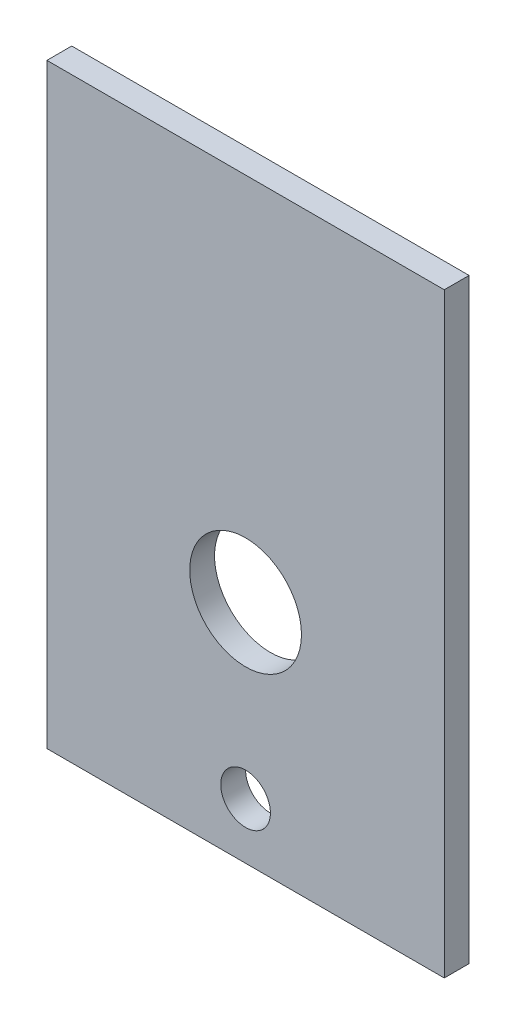
ISO-10303-21;
HEADER;
FILE_DESCRIPTION(('STEP AP214'),'2;1');
FILE_NAME('part.step','',(''),(''),'','','');
FILE_SCHEMA(('AUTOMOTIVE_DESIGN { 1 0 10303 214 1 1 1 1 }'));
ENDSEC;
DATA;
#1=APPLICATION_CONTEXT('core data for automotive mechanical design processes');
#2=APPLICATION_PROTOCOL_DEFINITION('international standard','automotive_design',2000,#1);
#3=PRODUCT_CONTEXT('',#1,'mechanical');
#4=PRODUCT('Part','Part','',(#3));
#5=PRODUCT_RELATED_PRODUCT_CATEGORY('part','',(#4));
#6=PRODUCT_DEFINITION_FORMATION('','',#4);
#7=PRODUCT_DEFINITION_CONTEXT('part definition',#1,'design');
#8=PRODUCT_DEFINITION('design','',#6,#7);
#9=PRODUCT_DEFINITION_SHAPE('','',#8);
#10=(LENGTH_UNIT() NAMED_UNIT(*) SI_UNIT(.MILLI.,.METRE.));
#11=(NAMED_UNIT(*) PLANE_ANGLE_UNIT() SI_UNIT($,.RADIAN.));
#12=(NAMED_UNIT(*) SI_UNIT($,.STERADIAN.) SOLID_ANGLE_UNIT());
#13=UNCERTAINTY_MEASURE_WITH_UNIT(LENGTH_MEASURE(1.E-05),#10,'distance_accuracy_value','');
#14=(GEOMETRIC_REPRESENTATION_CONTEXT(3) GLOBAL_UNCERTAINTY_ASSIGNED_CONTEXT((#13)) GLOBAL_UNIT_ASSIGNED_CONTEXT((#10,
#11,#12)) REPRESENTATION_CONTEXT('',''));
#15=CARTESIAN_POINT('',(0.,0.,0.));
#16=DIRECTION('',(0.,0.,1.));
#17=DIRECTION('',(1.,0.,0.));
#18=AXIS2_PLACEMENT_3D('',#15,#16,#17);
#19=CARTESIAN_POINT('',(0.,0.,6.35));
#20=DIRECTION('',(0.,0.,-1.));
#21=DIRECTION('',(-1.,0.,0.));
#22=AXIS2_PLACEMENT_3D('',#19,#20,#21);
#23=PLANE('',#22);
#24=DIRECTION('',(0.,-1.,0.));
#25=VECTOR('',#24,1.);
#26=CARTESIAN_POINT('',(0.,0.,6.35));
#27=LINE('',#26,#25);
#28=CARTESIAN_POINT('',(0.,152.4,6.35));
#29=VERTEX_POINT('',#28);
#30=CARTESIAN_POINT('',(0.,0.,6.35));
#31=VERTEX_POINT('',#30);
#32=EDGE_CURVE('E85',#29,#31,#27,.T.);
#33=ORIENTED_EDGE('',*,*,#32,.T.);
#34=DIRECTION('',(1.,0.,0.));
#35=VECTOR('',#34,1.);
#36=CARTESIAN_POINT('',(0.,0.,6.35));
#37=LINE('',#36,#35);
#38=CARTESIAN_POINT('',(101.6,0.,6.35));
#39=VERTEX_POINT('',#38);
#40=EDGE_CURVE('E80',#31,#39,#37,.T.);
#41=ORIENTED_EDGE('',*,*,#40,.T.);
#42=DIRECTION('',(0.,1.,0.));
#43=VECTOR('',#42,1.);
#44=CARTESIAN_POINT('',(101.6,0.,6.35));
#45=LINE('',#44,#43);
#46=CARTESIAN_POINT('',(101.6,152.4,6.35));
#47=VERTEX_POINT('',#46);
#48=EDGE_CURVE('E83',#39,#47,#45,.T.);
#49=ORIENTED_EDGE('',*,*,#48,.T.);
#50=DIRECTION('',(-1.,0.,0.));
#51=VECTOR('',#50,1.);
#52=CARTESIAN_POINT('',(0.,152.4,6.35));
#53=LINE('',#52,#51);
#54=EDGE_CURVE('E50',#47,#29,#53,.T.);
#55=ORIENTED_EDGE('',*,*,#54,.T.);
#56=EDGE_LOOP('',(#33,#41,#49,#55));
#57=FACE_BOUND('',#56,.T.);
#58=CARTESIAN_POINT('',(50.8,57.785,6.35));
#59=DIRECTION('',(0.,0.,1.));
#60=DIRECTION('',(1.,0.,0.));
#61=AXIS2_PLACEMENT_3D('',#58,#59,#60);
#62=CIRCLE('',#61,14.2875);
#63=CARTESIAN_POINT('',(65.0875,57.785,6.35));
#64=VERTEX_POINT('',#63);
#65=EDGE_CURVE('E100',#64,#64,#62,.T.);
#66=ORIENTED_EDGE('',*,*,#65,.F.);
#67=EDGE_LOOP('',(#66));
#68=FACE_BOUND('',#67,.T.);
#69=CARTESIAN_POINT('',(50.8,14.2875,6.35));
#70=DIRECTION('',(0.,0.,1.));
#71=DIRECTION('',(1.,0.,0.));
#72=AXIS2_PLACEMENT_3D('',#69,#70,#71);
#73=CIRCLE('',#72,6.35000000000001);
#74=CARTESIAN_POINT('',(57.15,14.2875,6.35));
#75=VERTEX_POINT('',#74);
#76=EDGE_CURVE('E115',#75,#75,#73,.T.);
#77=ORIENTED_EDGE('',*,*,#76,.F.);
#78=EDGE_LOOP('',(#77));
#79=FACE_BOUND('',#78,.T.);
#80=ADVANCED_FACE('F33',(#57,#68,#79),#23,.F.);
#81=CARTESIAN_POINT('',(0.,0.,0.));
#82=DIRECTION('',(0.,0.,-1.));
#83=DIRECTION('',(-1.,0.,0.));
#84=AXIS2_PLACEMENT_3D('',#81,#82,#83);
#85=PLANE('',#84);
#86=CARTESIAN_POINT('',(50.8,57.785,0.));
#87=DIRECTION('',(0.,0.,1.));
#88=DIRECTION('',(1.,0.,0.));
#89=AXIS2_PLACEMENT_3D('',#86,#87,#88);
#90=CIRCLE('',#89,14.2875);
#91=CARTESIAN_POINT('',(65.0875,57.785,0.));
#92=VERTEX_POINT('',#91);
#93=EDGE_CURVE('E112',#92,#92,#90,.T.);
#94=ORIENTED_EDGE('',*,*,#93,.T.);
#95=EDGE_LOOP('',(#94));
#96=FACE_BOUND('',#95,.T.);
#97=DIRECTION('',(0.,-1.,0.));
#98=VECTOR('',#97,1.);
#99=CARTESIAN_POINT('',(0.,0.,0.));
#100=LINE('',#99,#98);
#101=CARTESIAN_POINT('',(0.,152.4,0.));
#102=VERTEX_POINT('',#101);
#103=CARTESIAN_POINT('',(0.,0.,0.));
#104=VERTEX_POINT('',#103);
#105=EDGE_CURVE('E97',#102,#104,#100,.T.);
#106=ORIENTED_EDGE('',*,*,#105,.F.);
#107=DIRECTION('',(-1.,0.,0.));
#108=VECTOR('',#107,1.);
#109=CARTESIAN_POINT('',(0.,152.4,0.));
#110=LINE('',#109,#108);
#111=CARTESIAN_POINT('',(101.6,152.4,0.));
#112=VERTEX_POINT('',#111);
#113=EDGE_CURVE('E73',#112,#102,#110,.T.);
#114=ORIENTED_EDGE('',*,*,#113,.F.);
#115=DIRECTION('',(0.,1.,0.));
#116=VECTOR('',#115,1.);
#117=CARTESIAN_POINT('',(101.6,0.,0.));
#118=LINE('',#117,#116);
#119=CARTESIAN_POINT('',(101.6,0.,0.));
#120=VERTEX_POINT('',#119);
#121=EDGE_CURVE('E67',#120,#112,#118,.T.);
#122=ORIENTED_EDGE('',*,*,#121,.F.);
#123=DIRECTION('',(1.,0.,0.));
#124=VECTOR('',#123,1.);
#125=CARTESIAN_POINT('',(0.,0.,0.));
#126=LINE('',#125,#124);
#127=EDGE_CURVE('E89',#104,#120,#126,.T.);
#128=ORIENTED_EDGE('',*,*,#127,.F.);
#129=EDGE_LOOP('',(#106,#114,#122,#128));
#130=FACE_BOUND('',#129,.T.);
#131=CARTESIAN_POINT('',(50.8,14.2875,0.));
#132=DIRECTION('',(0.,0.,1.));
#133=DIRECTION('',(1.,0.,0.));
#134=AXIS2_PLACEMENT_3D('',#131,#132,#133);
#135=CIRCLE('',#134,6.35000000000001);
#136=CARTESIAN_POINT('',(57.15,14.2875,0.));
#137=VERTEX_POINT('',#136);
#138=EDGE_CURVE('E118',#137,#137,#135,.T.);
#139=ORIENTED_EDGE('',*,*,#138,.T.);
#140=EDGE_LOOP('',(#139));
#141=FACE_BOUND('',#140,.T.);
#142=ADVANCED_FACE('F108',(#96,#130,#141),#85,.T.);
#143=CARTESIAN_POINT('',(0.,0.,6.35));
#144=DIRECTION('',(1.,0.,0.));
#145=DIRECTION('',(0.,0.,-1.));
#146=AXIS2_PLACEMENT_3D('',#143,#144,#145);
#147=PLANE('',#146);
#148=ORIENTED_EDGE('',*,*,#105,.T.);
#149=DIRECTION('',(0.,0.,-1.));
#150=VECTOR('',#149,1.);
#151=CARTESIAN_POINT('',(0.,0.,6.35));
#152=LINE('',#151,#150);
#153=EDGE_CURVE('E11',#31,#104,#152,.T.);
#154=ORIENTED_EDGE('',*,*,#153,.F.);
#155=ORIENTED_EDGE('',*,*,#32,.F.);
#156=DIRECTION('',(0.,0.,-1.));
#157=VECTOR('',#156,1.);
#158=CARTESIAN_POINT('',(0.,152.4,6.35));
#159=LINE('',#158,#157);
#160=EDGE_CURVE('E93',#29,#102,#159,.T.);
#161=ORIENTED_EDGE('',*,*,#160,.T.);
#162=EDGE_LOOP('',(#148,#154,#155,#161));
#163=FACE_BOUND('',#162,.T.);
#164=ADVANCED_FACE('F35',(#163),#147,.F.);
#165=CARTESIAN_POINT('',(0.,0.,6.35));
#166=DIRECTION('',(0.,1.,0.));
#167=DIRECTION('',(0.,0.,1.));
#168=AXIS2_PLACEMENT_3D('',#165,#166,#167);
#169=PLANE('',#168);
#170=ORIENTED_EDGE('',*,*,#127,.T.);
#171=DIRECTION('',(0.,0.,-1.));
#172=VECTOR('',#171,1.);
#173=CARTESIAN_POINT('',(101.6,0.,6.35));
#174=LINE('',#173,#172);
#175=EDGE_CURVE('E42',#39,#120,#174,.T.);
#176=ORIENTED_EDGE('',*,*,#175,.F.);
#177=ORIENTED_EDGE('',*,*,#40,.F.);
#178=ORIENTED_EDGE('',*,*,#153,.T.);
#179=EDGE_LOOP('',(#170,#176,#177,#178));
#180=FACE_BOUND('',#179,.T.);
#181=ADVANCED_FACE('F88',(#180),#169,.F.);
#182=CARTESIAN_POINT('',(101.6,0.,6.35));
#183=DIRECTION('',(-1.,0.,0.));
#184=DIRECTION('',(0.,0.,1.));
#185=AXIS2_PLACEMENT_3D('',#182,#183,#184);
#186=PLANE('',#185);
#187=ORIENTED_EDGE('',*,*,#121,.T.);
#188=DIRECTION('',(0.,0.,-1.));
#189=VECTOR('',#188,1.);
#190=CARTESIAN_POINT('',(101.6,152.4,6.35));
#191=LINE('',#190,#189);
#192=EDGE_CURVE('E90',#47,#112,#191,.T.);
#193=ORIENTED_EDGE('',*,*,#192,.F.);
#194=ORIENTED_EDGE('',*,*,#48,.F.);
#195=ORIENTED_EDGE('',*,*,#175,.T.);
#196=EDGE_LOOP('',(#187,#193,#194,#195));
#197=FACE_BOUND('',#196,.T.);
#198=ADVANCED_FACE('F91',(#197),#186,.F.);
#199=CARTESIAN_POINT('',(0.,152.4,6.35));
#200=DIRECTION('',(0.,-1.,0.));
#201=DIRECTION('',(0.,0.,-1.));
#202=AXIS2_PLACEMENT_3D('',#199,#200,#201);
#203=PLANE('',#202);
#204=ORIENTED_EDGE('',*,*,#113,.T.);
#205=ORIENTED_EDGE('',*,*,#160,.F.);
#206=ORIENTED_EDGE('',*,*,#54,.F.);
#207=ORIENTED_EDGE('',*,*,#192,.T.);
#208=EDGE_LOOP('',(#204,#205,#206,#207));
#209=FACE_BOUND('',#208,.T.);
#210=ADVANCED_FACE('F105',(#209),#203,.F.);
#211=CARTESIAN_POINT('',(50.8,57.785,6.35));
#212=DIRECTION('',(0.,0.,-1.));
#213=DIRECTION('',(-1.,0.,0.));
#214=AXIS2_PLACEMENT_3D('',#211,#212,#213);
#215=CYLINDRICAL_SURFACE('',#214,14.2875);
#216=ORIENTED_EDGE('',*,*,#65,.T.);
#217=EDGE_LOOP('',(#216));
#218=FACE_BOUND('',#217,.T.);
#219=ORIENTED_EDGE('',*,*,#93,.F.);
#220=EDGE_LOOP('',(#219));
#221=FACE_BOUND('',#220,.T.);
#222=ADVANCED_FACE('F135',(#218,#221),#215,.F.);
#223=CARTESIAN_POINT('',(50.8,14.2875,6.35));
#224=DIRECTION('',(0.,0.,-1.));
#225=DIRECTION('',(-1.,0.,0.));
#226=AXIS2_PLACEMENT_3D('',#223,#224,#225);
#227=CYLINDRICAL_SURFACE('',#226,6.35000000000001);
#228=ORIENTED_EDGE('',*,*,#76,.T.);
#229=EDGE_LOOP('',(#228));
#230=FACE_BOUND('',#229,.T.);
#231=ORIENTED_EDGE('',*,*,#138,.F.);
#232=EDGE_LOOP('',(#231));
#233=FACE_BOUND('',#232,.T.);
#234=ADVANCED_FACE('F124',(#230,#233),#227,.F.);
#235=CLOSED_SHELL('',(#80,#142,#164,#181,#198,#210,#222,#234));
#236=MANIFOLD_SOLID_BREP('B2',#235);
#237=ADVANCED_BREP_SHAPE_REPRESENTATION('',(#18,#236),#14);
#238=SHAPE_DEFINITION_REPRESENTATION(#9,#237);
ENDSEC;
END-ISO-10303-21;
